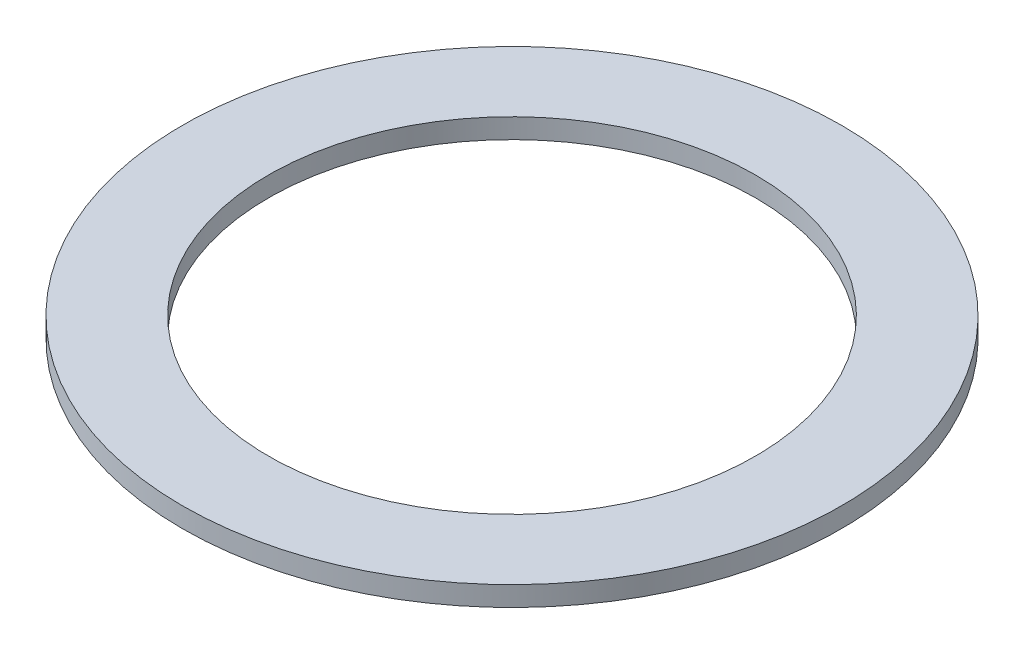
ISO-10303-21;
HEADER;
FILE_DESCRIPTION(('STEP AP214'),'2;1');
FILE_NAME('part.step','',(''),(''),'','','');
FILE_SCHEMA(('AUTOMOTIVE_DESIGN { 1 0 10303 214 1 1 1 1 }'));
ENDSEC;
DATA;
#1=APPLICATION_CONTEXT('core data for automotive mechanical design processes');
#2=APPLICATION_PROTOCOL_DEFINITION('international standard','automotive_design',2000,#1);
#3=PRODUCT_CONTEXT('',#1,'mechanical');
#4=PRODUCT('Part','Part','',(#3));
#5=PRODUCT_RELATED_PRODUCT_CATEGORY('part','',(#4));
#6=PRODUCT_DEFINITION_FORMATION('','',#4);
#7=PRODUCT_DEFINITION_CONTEXT('part definition',#1,'design');
#8=PRODUCT_DEFINITION('design','',#6,#7);
#9=PRODUCT_DEFINITION_SHAPE('','',#8);
#10=(LENGTH_UNIT() NAMED_UNIT(*) SI_UNIT(.MILLI.,.METRE.));
#11=(NAMED_UNIT(*) PLANE_ANGLE_UNIT() SI_UNIT($,.RADIAN.));
#12=(NAMED_UNIT(*) SI_UNIT($,.STERADIAN.) SOLID_ANGLE_UNIT());
#13=UNCERTAINTY_MEASURE_WITH_UNIT(LENGTH_MEASURE(1.E-05),#10,'distance_accuracy_value','');
#14=(GEOMETRIC_REPRESENTATION_CONTEXT(3) GLOBAL_UNCERTAINTY_ASSIGNED_CONTEXT((#13)) GLOBAL_UNIT_ASSIGNED_CONTEXT((#10,
#11,#12)) REPRESENTATION_CONTEXT('',''));
#15=CARTESIAN_POINT('',(0.,0.,0.));
#16=DIRECTION('',(0.,0.,1.));
#17=DIRECTION('',(1.,0.,0.));
#18=AXIS2_PLACEMENT_3D('',#15,#16,#17);
#19=CARTESIAN_POINT('',(0.,0.,0.));
#20=DIRECTION('',(0.,-1.,0.));
#21=DIRECTION('',(0.,0.,-1.));
#22=AXIS2_PLACEMENT_3D('',#19,#20,#21);
#23=CYLINDRICAL_SURFACE('',#22,18.4);
#24=CARTESIAN_POINT('',(0.,1.5,0.));
#25=DIRECTION('',(0.,-1.,0.));
#26=DIRECTION('',(0.,0.,-1.));
#27=AXIS2_PLACEMENT_3D('',#24,#25,#26);
#28=CIRCLE('',#27,18.4);
#29=CARTESIAN_POINT('',(0.,1.5,-18.4));
#30=VERTEX_POINT('',#29);
#31=EDGE_CURVE('E10',#30,#30,#28,.T.);
#32=ORIENTED_EDGE('',*,*,#31,.F.);
#33=EDGE_LOOP('',(#32));
#34=FACE_BOUND('',#33,.T.);
#35=CARTESIAN_POINT('',(0.,0.,0.));
#36=DIRECTION('',(0.,-1.,0.));
#37=DIRECTION('',(0.,0.,-1.));
#38=AXIS2_PLACEMENT_3D('',#35,#36,#37);
#39=CIRCLE('',#38,18.4);
#40=CARTESIAN_POINT('',(0.,0.,-18.4));
#41=VERTEX_POINT('',#40);
#42=EDGE_CURVE('E44',#41,#41,#39,.T.);
#43=ORIENTED_EDGE('',*,*,#42,.T.);
#44=EDGE_LOOP('',(#43));
#45=FACE_BOUND('',#44,.T.);
#46=ADVANCED_FACE('F30',(#34,#45),#23,.F.);
#47=CARTESIAN_POINT('',(-18.4,1.5,0.));
#48=DIRECTION('',(0.,-1.,0.));
#49=DIRECTION('',(0.,0.,-1.));
#50=AXIS2_PLACEMENT_3D('',#47,#48,#49);
#51=PLANE('',#50);
#52=CARTESIAN_POINT('',(0.,1.5,0.));
#53=DIRECTION('',(0.,-1.,0.));
#54=DIRECTION('',(0.,0.,-1.));
#55=AXIS2_PLACEMENT_3D('',#52,#53,#54);
#56=CIRCLE('',#55,24.9);
#57=CARTESIAN_POINT('',(0.,1.5,-24.9));
#58=VERTEX_POINT('',#57);
#59=EDGE_CURVE('E36',#58,#58,#56,.T.);
#60=ORIENTED_EDGE('',*,*,#59,.F.);
#61=EDGE_LOOP('',(#60));
#62=FACE_BOUND('',#61,.T.);
#63=ORIENTED_EDGE('',*,*,#31,.T.);
#64=EDGE_LOOP('',(#63));
#65=FACE_BOUND('',#64,.T.);
#66=ADVANCED_FACE('F59',(#62,#65),#51,.F.);
#67=CARTESIAN_POINT('',(0.,0.,0.));
#68=DIRECTION('',(0.,-1.,0.));
#69=DIRECTION('',(0.,0.,-1.));
#70=AXIS2_PLACEMENT_3D('',#67,#68,#69);
#71=CYLINDRICAL_SURFACE('',#70,24.9);
#72=CARTESIAN_POINT('',(0.,0.,0.));
#73=DIRECTION('',(0.,-1.,0.));
#74=DIRECTION('',(0.,0.,-1.));
#75=AXIS2_PLACEMENT_3D('',#72,#73,#74);
#76=CIRCLE('',#75,24.9);
#77=CARTESIAN_POINT('',(0.,0.,-24.9));
#78=VERTEX_POINT('',#77);
#79=EDGE_CURVE('E40',#78,#78,#76,.T.);
#80=ORIENTED_EDGE('',*,*,#79,.F.);
#81=EDGE_LOOP('',(#80));
#82=FACE_BOUND('',#81,.T.);
#83=ORIENTED_EDGE('',*,*,#59,.T.);
#84=EDGE_LOOP('',(#83));
#85=FACE_BOUND('',#84,.T.);
#86=ADVANCED_FACE('F54',(#82,#85),#71,.T.);
#87=CARTESIAN_POINT('',(-18.4,0.,0.));
#88=DIRECTION('',(0.,1.,0.));
#89=DIRECTION('',(0.,0.,1.));
#90=AXIS2_PLACEMENT_3D('',#87,#88,#89);
#91=PLANE('',#90);
#92=ORIENTED_EDGE('',*,*,#42,.F.);
#93=EDGE_LOOP('',(#92));
#94=FACE_BOUND('',#93,.T.);
#95=ORIENTED_EDGE('',*,*,#79,.T.);
#96=EDGE_LOOP('',(#95));
#97=FACE_BOUND('',#96,.T.);
#98=ADVANCED_FACE('F51',(#94,#97),#91,.F.);
#99=CLOSED_SHELL('',(#46,#66,#86,#98));
#100=MANIFOLD_SOLID_BREP('B2',#99);
#101=ADVANCED_BREP_SHAPE_REPRESENTATION('',(#18,#100),#14);
#102=SHAPE_DEFINITION_REPRESENTATION(#9,#101);
ENDSEC;
END-ISO-10303-21;
